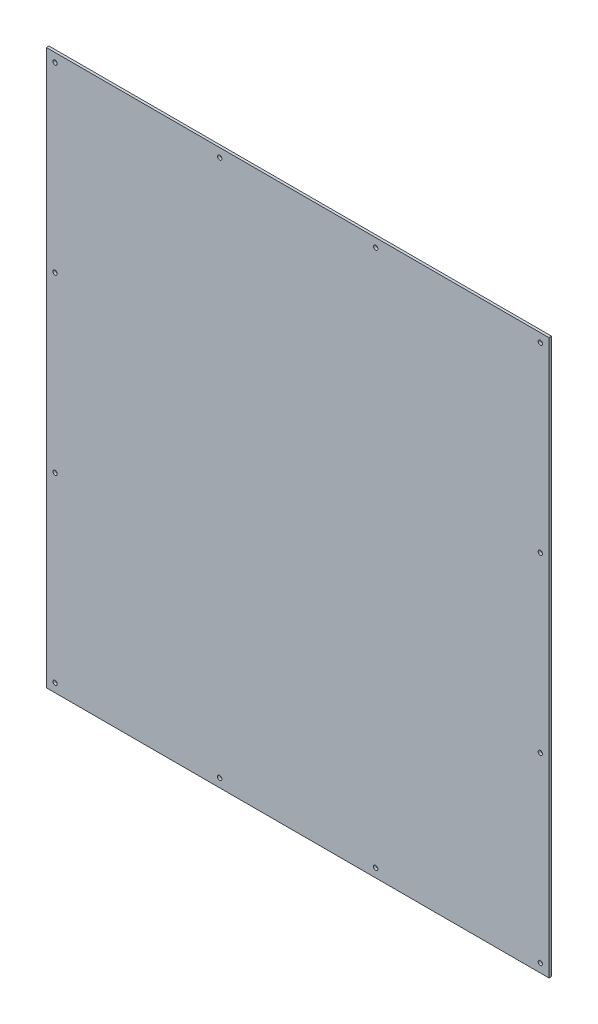
ISO-10303-21;
HEADER;
FILE_DESCRIPTION(('STEP AP214'),'2;1');
FILE_NAME('part.step','',(''),(''),'','','');
FILE_SCHEMA(('AUTOMOTIVE_DESIGN { 1 0 10303 214 1 1 1 1 }'));
ENDSEC;
DATA;
#1=APPLICATION_CONTEXT('core data for automotive mechanical design processes');
#2=APPLICATION_PROTOCOL_DEFINITION('international standard','automotive_design',2000,#1);
#3=PRODUCT_CONTEXT('',#1,'mechanical');
#4=PRODUCT('Part','Part','',(#3));
#5=PRODUCT_RELATED_PRODUCT_CATEGORY('part','',(#4));
#6=PRODUCT_DEFINITION_FORMATION('','',#4);
#7=PRODUCT_DEFINITION_CONTEXT('part definition',#1,'design');
#8=PRODUCT_DEFINITION('design','',#6,#7);
#9=PRODUCT_DEFINITION_SHAPE('','',#8);
#10=(LENGTH_UNIT() NAMED_UNIT(*) SI_UNIT(.MILLI.,.METRE.));
#11=(NAMED_UNIT(*) PLANE_ANGLE_UNIT() SI_UNIT($,.RADIAN.));
#12=(NAMED_UNIT(*) SI_UNIT($,.STERADIAN.) SOLID_ANGLE_UNIT());
#13=UNCERTAINTY_MEASURE_WITH_UNIT(LENGTH_MEASURE(1.E-05),#10,'distance_accuracy_value','');
#14=(GEOMETRIC_REPRESENTATION_CONTEXT(3) GLOBAL_UNCERTAINTY_ASSIGNED_CONTEXT((#13)) GLOBAL_UNIT_ASSIGNED_CONTEXT((#10,
#11,#12)) REPRESENTATION_CONTEXT('',''));
#15=CARTESIAN_POINT('',(0.,0.,0.));
#16=DIRECTION('',(0.,0.,1.));
#17=DIRECTION('',(1.,0.,0.));
#18=AXIS2_PLACEMENT_3D('',#15,#16,#17);
#19=CARTESIAN_POINT('',(-219.558359621451,289.085173501577,3.));
#20=DIRECTION('',(1.,0.,0.));
#21=DIRECTION('',(0.,1.,0.));
#22=AXIS2_PLACEMENT_3D('',#19,#20,#21);
#23=PLANE('',#22);
#24=DIRECTION('',(0.,-1.,0.));
#25=VECTOR('',#24,1.);
#26=CARTESIAN_POINT('',(-219.558359621451,289.085173501577,0.));
#27=LINE('',#26,#25);
#28=CARTESIAN_POINT('',(-219.558359621451,289.085173501577,0.));
#29=VERTEX_POINT('',#28);
#30=CARTESIAN_POINT('',(-219.558359621451,-350.914826498423,0.));
#31=VERTEX_POINT('',#30);
#32=EDGE_CURVE('E96',#29,#31,#27,.T.);
#33=ORIENTED_EDGE('',*,*,#32,.T.);
#34=DIRECTION('',(0.,0.,-1.));
#35=VECTOR('',#34,1.);
#36=CARTESIAN_POINT('',(-219.558359621451,-350.914826498423,3.));
#37=LINE('',#36,#35);
#38=CARTESIAN_POINT('',(-219.558359621451,-350.914826498423,3.));
#39=VERTEX_POINT('',#38);
#40=EDGE_CURVE('E11',#39,#31,#37,.T.);
#41=ORIENTED_EDGE('',*,*,#40,.F.);
#42=DIRECTION('',(0.,-1.,0.));
#43=VECTOR('',#42,1.);
#44=CARTESIAN_POINT('',(-219.558359621451,289.085173501577,3.));
#45=LINE('',#44,#43);
#46=CARTESIAN_POINT('',(-219.558359621451,289.085173501577,3.));
#47=VERTEX_POINT('',#46);
#48=EDGE_CURVE('E84',#47,#39,#45,.T.);
#49=ORIENTED_EDGE('',*,*,#48,.F.);
#50=DIRECTION('',(0.,0.,-1.));
#51=VECTOR('',#50,1.);
#52=CARTESIAN_POINT('',(-219.558359621451,289.085173501577,3.));
#53=LINE('',#52,#51);
#54=EDGE_CURVE('E92',#47,#29,#53,.T.);
#55=ORIENTED_EDGE('',*,*,#54,.T.);
#56=EDGE_LOOP('',(#33,#41,#49,#55));
#57=FACE_BOUND('',#56,.T.);
#58=ADVANCED_FACE('F33',(#57),#23,.F.);
#59=CARTESIAN_POINT('',(-219.558359621451,-350.914826498423,3.));
#60=DIRECTION('',(0.,1.,0.));
#61=DIRECTION('',(0.,0.,1.));
#62=AXIS2_PLACEMENT_3D('',#59,#60,#61);
#63=PLANE('',#62);
#64=DIRECTION('',(1.,0.,0.));
#65=VECTOR('',#64,1.);
#66=CARTESIAN_POINT('',(-219.558359621451,-350.914826498423,0.));
#67=LINE('',#66,#65);
#68=CARTESIAN_POINT('',(360.441640378549,-350.914826498423,0.));
#69=VERTEX_POINT('',#68);
#70=EDGE_CURVE('E88',#31,#69,#67,.T.);
#71=ORIENTED_EDGE('',*,*,#70,.T.);
#72=DIRECTION('',(0.,0.,-1.));
#73=VECTOR('',#72,1.);
#74=CARTESIAN_POINT('',(360.441640378549,-350.914826498423,3.));
#75=LINE('',#74,#73);
#76=CARTESIAN_POINT('',(360.441640378549,-350.914826498423,3.));
#77=VERTEX_POINT('',#76);
#78=EDGE_CURVE('E41',#77,#69,#75,.T.);
#79=ORIENTED_EDGE('',*,*,#78,.F.);
#80=DIRECTION('',(1.,0.,0.));
#81=VECTOR('',#80,1.);
#82=CARTESIAN_POINT('',(-219.558359621451,-350.914826498423,3.));
#83=LINE('',#82,#81);
#84=EDGE_CURVE('E79',#39,#77,#83,.T.);
#85=ORIENTED_EDGE('',*,*,#84,.F.);
#86=ORIENTED_EDGE('',*,*,#40,.T.);
#87=EDGE_LOOP('',(#71,#79,#85,#86));
#88=FACE_BOUND('',#87,.T.);
#89=ADVANCED_FACE('F87',(#88),#63,.F.);
#90=CARTESIAN_POINT('',(360.441640378549,289.085173501577,3.));
#91=DIRECTION('',(-1.,0.,0.));
#92=DIRECTION('',(0.,-1.,0.));
#93=AXIS2_PLACEMENT_3D('',#90,#91,#92);
#94=PLANE('',#93);
#95=DIRECTION('',(0.,1.,0.));
#96=VECTOR('',#95,1.);
#97=CARTESIAN_POINT('',(360.441640378549,289.085173501577,0.));
#98=LINE('',#97,#96);
#99=CARTESIAN_POINT('',(360.441640378549,289.085173501577,0.));
#100=VERTEX_POINT('',#99);
#101=EDGE_CURVE('E66',#69,#100,#98,.T.);
#102=ORIENTED_EDGE('',*,*,#101,.T.);
#103=DIRECTION('',(0.,0.,-1.));
#104=VECTOR('',#103,1.);
#105=CARTESIAN_POINT('',(360.441640378549,289.085173501577,3.));
#106=LINE('',#105,#104);
#107=CARTESIAN_POINT('',(360.441640378549,289.085173501577,3.));
#108=VERTEX_POINT('',#107);
#109=EDGE_CURVE('E89',#108,#100,#106,.T.);
#110=ORIENTED_EDGE('',*,*,#109,.F.);
#111=DIRECTION('',(0.,1.,0.));
#112=VECTOR('',#111,1.);
#113=CARTESIAN_POINT('',(360.441640378549,289.085173501577,3.));
#114=LINE('',#113,#112);
#115=EDGE_CURVE('E82',#77,#108,#114,.T.);
#116=ORIENTED_EDGE('',*,*,#115,.F.);
#117=ORIENTED_EDGE('',*,*,#78,.T.);
#118=EDGE_LOOP('',(#102,#110,#116,#117));
#119=FACE_BOUND('',#118,.T.);
#120=ADVANCED_FACE('F90',(#119),#94,.F.);
#121=CARTESIAN_POINT('',(-219.558359621451,289.085173501577,3.));
#122=DIRECTION('',(0.,-1.,0.));
#123=DIRECTION('',(0.,0.,-1.));
#124=AXIS2_PLACEMENT_3D('',#121,#122,#123);
#125=PLANE('',#124);
#126=DIRECTION('',(-1.,0.,0.));
#127=VECTOR('',#126,1.);
#128=CARTESIAN_POINT('',(-219.558359621451,289.085173501577,0.));
#129=LINE('',#128,#127);
#130=EDGE_CURVE('E72',#100,#29,#129,.T.);
#131=ORIENTED_EDGE('',*,*,#130,.T.);
#132=ORIENTED_EDGE('',*,*,#54,.F.);
#133=DIRECTION('',(-1.,0.,0.));
#134=VECTOR('',#133,1.);
#135=CARTESIAN_POINT('',(-219.558359621451,289.085173501577,3.));
#136=LINE('',#135,#134);
#137=EDGE_CURVE('E49',#108,#47,#136,.T.);
#138=ORIENTED_EDGE('',*,*,#137,.F.);
#139=ORIENTED_EDGE('',*,*,#109,.T.);
#140=EDGE_LOOP('',(#131,#132,#138,#139));
#141=FACE_BOUND('',#140,.T.);
#142=ADVANCED_FACE('F104',(#141),#125,.F.);
#143=CARTESIAN_POINT('',(0.,0.,3.));
#144=DIRECTION('',(0.,0.,1.));
#145=DIRECTION('',(1.,0.,0.));
#146=AXIS2_PLACEMENT_3D('',#143,#144,#145);
#147=PLANE('',#146);
#148=CARTESIAN_POINT('',(-19.558359621451,-340.914826498423,3.));
#149=DIRECTION('',(0.,0.,1.));
#150=DIRECTION('',(1.,0.,0.));
#151=AXIS2_PLACEMENT_3D('',#148,#149,#150);
#152=CIRCLE('',#151,2.5);
#153=CARTESIAN_POINT('',(-17.058359621451,-340.914826498423,3.));
#154=VERTEX_POINT('',#153);
#155=EDGE_CURVE('E140',#154,#154,#152,.T.);
#156=ORIENTED_EDGE('',*,*,#155,.F.);
#157=EDGE_LOOP('',(#156));
#158=FACE_BOUND('',#157,.T.);
#159=CARTESIAN_POINT('',(350.441640378549,-340.914826498423,3.));
#160=DIRECTION('',(0.,0.,1.));
#161=DIRECTION('',(1.,0.,0.));
#162=AXIS2_PLACEMENT_3D('',#159,#160,#161);
#163=CIRCLE('',#162,2.49999999999997);
#164=CARTESIAN_POINT('',(352.941640378549,-340.914826498423,3.));
#165=VERTEX_POINT('',#164);
#166=EDGE_CURVE('E147',#165,#165,#163,.T.);
#167=ORIENTED_EDGE('',*,*,#166,.F.);
#168=EDGE_LOOP('',(#167));
#169=FACE_BOUND('',#168,.T.);
#170=CARTESIAN_POINT('',(350.441640378549,-130.914826498423,3.));
#171=DIRECTION('',(0.,0.,1.));
#172=DIRECTION('',(1.,0.,0.));
#173=AXIS2_PLACEMENT_3D('',#170,#171,#172);
#174=CIRCLE('',#173,2.49999999999996);
#175=CARTESIAN_POINT('',(352.941640378549,-130.914826498423,3.));
#176=VERTEX_POINT('',#175);
#177=EDGE_CURVE('E153',#176,#176,#174,.T.);
#178=ORIENTED_EDGE('',*,*,#177,.F.);
#179=EDGE_LOOP('',(#178));
#180=FACE_BOUND('',#179,.T.);
#181=CARTESIAN_POINT('',(350.441640378549,69.0851735015771,3.));
#182=DIRECTION('',(0.,0.,1.));
#183=DIRECTION('',(1.,0.,0.));
#184=AXIS2_PLACEMENT_3D('',#181,#182,#183);
#185=CIRCLE('',#184,2.49999999999997);
#186=CARTESIAN_POINT('',(352.941640378549,69.0851735015771,3.));
#187=VERTEX_POINT('',#186);
#188=EDGE_CURVE('E159',#187,#187,#185,.T.);
#189=ORIENTED_EDGE('',*,*,#188,.F.);
#190=EDGE_LOOP('',(#189));
#191=FACE_BOUND('',#190,.T.);
#192=CARTESIAN_POINT('',(-209.558359621451,69.0851735015771,3.));
#193=DIRECTION('',(0.,0.,1.));
#194=DIRECTION('',(1.,0.,0.));
#195=AXIS2_PLACEMENT_3D('',#192,#193,#194);
#196=CIRCLE('',#195,2.5);
#197=CARTESIAN_POINT('',(-207.058359621451,69.0851735015771,3.));
#198=VERTEX_POINT('',#197);
#199=EDGE_CURVE('E123',#198,#198,#196,.T.);
#200=ORIENTED_EDGE('',*,*,#199,.F.);
#201=EDGE_LOOP('',(#200));
#202=FACE_BOUND('',#201,.T.);
#203=CARTESIAN_POINT('',(-209.558359621451,-340.914826498423,3.));
#204=DIRECTION('',(0.,0.,1.));
#205=DIRECTION('',(1.,0.,0.));
#206=AXIS2_PLACEMENT_3D('',#203,#204,#205);
#207=CIRCLE('',#206,2.5);
#208=CARTESIAN_POINT('',(-207.058359621451,-340.914826498423,3.));
#209=VERTEX_POINT('',#208);
#210=EDGE_CURVE('E116',#209,#209,#207,.T.);
#211=ORIENTED_EDGE('',*,*,#210,.F.);
#212=EDGE_LOOP('',(#211));
#213=FACE_BOUND('',#212,.T.);
#214=CARTESIAN_POINT('',(-209.558359621451,-130.914826498423,3.));
#215=DIRECTION('',(0.,0.,1.));
#216=DIRECTION('',(1.,0.,0.));
#217=AXIS2_PLACEMENT_3D('',#214,#215,#216);
#218=CIRCLE('',#217,2.5);
#219=CARTESIAN_POINT('',(-207.058359621451,-130.914826498423,3.));
#220=VERTEX_POINT('',#219);
#221=EDGE_CURVE('E135',#220,#220,#218,.T.);
#222=ORIENTED_EDGE('',*,*,#221,.F.);
#223=EDGE_LOOP('',(#222));
#224=FACE_BOUND('',#223,.T.);
#225=CARTESIAN_POINT('',(350.441640378549,279.085173501577,3.));
#226=DIRECTION('',(0.,0.,1.));
#227=DIRECTION('',(1.,0.,0.));
#228=AXIS2_PLACEMENT_3D('',#225,#226,#227);
#229=CIRCLE('',#228,2.49999999999997);
#230=CARTESIAN_POINT('',(352.941640378549,279.085173501577,3.));
#231=VERTEX_POINT('',#230);
#232=EDGE_CURVE('E128',#231,#231,#229,.T.);
#233=ORIENTED_EDGE('',*,*,#232,.F.);
#234=EDGE_LOOP('',(#233));
#235=FACE_BOUND('',#234,.T.);
#236=CARTESIAN_POINT('',(160.441640378549,279.085173501577,3.));
#237=DIRECTION('',(0.,0.,1.));
#238=DIRECTION('',(1.,0.,0.));
#239=AXIS2_PLACEMENT_3D('',#236,#237,#238);
#240=CIRCLE('',#239,2.5);
#241=CARTESIAN_POINT('',(162.941640378549,279.085173501577,3.));
#242=VERTEX_POINT('',#241);
#243=EDGE_CURVE('E176',#242,#242,#240,.T.);
#244=ORIENTED_EDGE('',*,*,#243,.F.);
#245=EDGE_LOOP('',(#244));
#246=FACE_BOUND('',#245,.T.);
#247=CARTESIAN_POINT('',(-19.558359621451,279.085173501577,3.));
#248=DIRECTION('',(0.,0.,1.));
#249=DIRECTION('',(1.,0.,0.));
#250=AXIS2_PLACEMENT_3D('',#247,#248,#249);
#251=CIRCLE('',#250,2.5);
#252=CARTESIAN_POINT('',(-17.058359621451,279.085173501577,3.));
#253=VERTEX_POINT('',#252);
#254=EDGE_CURVE('E164',#253,#253,#251,.T.);
#255=ORIENTED_EDGE('',*,*,#254,.F.);
#256=EDGE_LOOP('',(#255));
#257=FACE_BOUND('',#256,.T.);
#258=CARTESIAN_POINT('',(160.441640378549,-340.914826498423,3.));
#259=DIRECTION('',(0.,0.,1.));
#260=DIRECTION('',(1.,0.,0.));
#261=AXIS2_PLACEMENT_3D('',#258,#259,#260);
#262=CIRCLE('',#261,2.5);
#263=CARTESIAN_POINT('',(162.941640378549,-340.914826498423,3.));
#264=VERTEX_POINT('',#263);
#265=EDGE_CURVE('E171',#264,#264,#262,.T.);
#266=ORIENTED_EDGE('',*,*,#265,.F.);
#267=EDGE_LOOP('',(#266));
#268=FACE_BOUND('',#267,.T.);
#269=CARTESIAN_POINT('',(-209.558359621451,279.085173501577,3.));
#270=DIRECTION('',(0.,0.,1.));
#271=DIRECTION('',(1.,0.,0.));
#272=AXIS2_PLACEMENT_3D('',#269,#270,#271);
#273=CIRCLE('',#272,2.5);
#274=CARTESIAN_POINT('',(-207.058359621451,279.085173501577,3.));
#275=VERTEX_POINT('',#274);
#276=EDGE_CURVE('E110',#275,#275,#273,.T.);
#277=ORIENTED_EDGE('',*,*,#276,.F.);
#278=EDGE_LOOP('',(#277));
#279=FACE_BOUND('',#278,.T.);
#280=ORIENTED_EDGE('',*,*,#48,.T.);
#281=ORIENTED_EDGE('',*,*,#84,.T.);
#282=ORIENTED_EDGE('',*,*,#115,.T.);
#283=ORIENTED_EDGE('',*,*,#137,.T.);
#284=EDGE_LOOP('',(#280,#281,#282,#283));
#285=FACE_BOUND('',#284,.T.);
#286=ADVANCED_FACE('F80',(#158,#169,#180,#191,#202,#213,#224,#235,#246,#257,#268,#279,#285),
#147,.T.);
#287=CARTESIAN_POINT('',(0.,0.,0.));
#288=DIRECTION('',(0.,0.,1.));
#289=DIRECTION('',(1.,0.,0.));
#290=AXIS2_PLACEMENT_3D('',#287,#288,#289);
#291=PLANE('',#290);
#292=CARTESIAN_POINT('',(-19.558359621451,-340.914826498423,0.));
#293=DIRECTION('',(0.,0.,1.));
#294=DIRECTION('',(1.,0.,0.));
#295=AXIS2_PLACEMENT_3D('',#292,#293,#294);
#296=CIRCLE('',#295,2.5);
#297=CARTESIAN_POINT('',(-17.058359621451,-340.914826498423,0.));
#298=VERTEX_POINT('',#297);
#299=EDGE_CURVE('E143',#298,#298,#296,.T.);
#300=ORIENTED_EDGE('',*,*,#299,.T.);
#301=EDGE_LOOP('',(#300));
#302=FACE_BOUND('',#301,.T.);
#303=CARTESIAN_POINT('',(350.441640378549,-340.914826498423,0.));
#304=DIRECTION('',(0.,0.,1.));
#305=DIRECTION('',(1.,0.,0.));
#306=AXIS2_PLACEMENT_3D('',#303,#304,#305);
#307=CIRCLE('',#306,2.49999999999997);
#308=CARTESIAN_POINT('',(352.941640378549,-340.914826498423,0.));
#309=VERTEX_POINT('',#308);
#310=EDGE_CURVE('E150',#309,#309,#307,.T.);
#311=ORIENTED_EDGE('',*,*,#310,.T.);
#312=EDGE_LOOP('',(#311));
#313=FACE_BOUND('',#312,.T.);
#314=CARTESIAN_POINT('',(350.441640378549,-130.914826498423,0.));
#315=DIRECTION('',(0.,0.,1.));
#316=DIRECTION('',(1.,0.,0.));
#317=AXIS2_PLACEMENT_3D('',#314,#315,#316);
#318=CIRCLE('',#317,2.49999999999996);
#319=CARTESIAN_POINT('',(352.941640378549,-130.914826498423,0.));
#320=VERTEX_POINT('',#319);
#321=EDGE_CURVE('E156',#320,#320,#318,.T.);
#322=ORIENTED_EDGE('',*,*,#321,.T.);
#323=EDGE_LOOP('',(#322));
#324=FACE_BOUND('',#323,.T.);
#325=CARTESIAN_POINT('',(350.441640378549,69.0851735015771,0.));
#326=DIRECTION('',(0.,0.,1.));
#327=DIRECTION('',(1.,0.,0.));
#328=AXIS2_PLACEMENT_3D('',#325,#326,#327);
#329=CIRCLE('',#328,2.49999999999997);
#330=CARTESIAN_POINT('',(352.941640378549,69.0851735015771,0.));
#331=VERTEX_POINT('',#330);
#332=EDGE_CURVE('E132',#331,#331,#329,.T.);
#333=ORIENTED_EDGE('',*,*,#332,.T.);
#334=EDGE_LOOP('',(#333));
#335=FACE_BOUND('',#334,.T.);
#336=CARTESIAN_POINT('',(-209.558359621451,69.0851735015771,0.));
#337=DIRECTION('',(0.,0.,1.));
#338=DIRECTION('',(1.,0.,0.));
#339=AXIS2_PLACEMENT_3D('',#336,#337,#338);
#340=CIRCLE('',#339,2.5);
#341=CARTESIAN_POINT('',(-207.058359621451,69.0851735015771,0.));
#342=VERTEX_POINT('',#341);
#343=EDGE_CURVE('E113',#342,#342,#340,.T.);
#344=ORIENTED_EDGE('',*,*,#343,.T.);
#345=EDGE_LOOP('',(#344));
#346=FACE_BOUND('',#345,.T.);
#347=CARTESIAN_POINT('',(-209.558359621451,-340.914826498423,0.));
#348=DIRECTION('',(0.,0.,1.));
#349=DIRECTION('',(1.,0.,0.));
#350=AXIS2_PLACEMENT_3D('',#347,#348,#349);
#351=CIRCLE('',#350,2.5);
#352=CARTESIAN_POINT('',(-207.058359621451,-340.914826498423,0.));
#353=VERTEX_POINT('',#352);
#354=EDGE_CURVE('E119',#353,#353,#351,.T.);
#355=ORIENTED_EDGE('',*,*,#354,.T.);
#356=EDGE_LOOP('',(#355));
#357=FACE_BOUND('',#356,.T.);
#358=CARTESIAN_POINT('',(-209.558359621451,-130.914826498423,0.));
#359=DIRECTION('',(0.,0.,1.));
#360=DIRECTION('',(1.,0.,0.));
#361=AXIS2_PLACEMENT_3D('',#358,#359,#360);
#362=CIRCLE('',#361,2.5);
#363=CARTESIAN_POINT('',(-207.058359621451,-130.914826498423,0.));
#364=VERTEX_POINT('',#363);
#365=EDGE_CURVE('E120',#364,#364,#362,.T.);
#366=ORIENTED_EDGE('',*,*,#365,.T.);
#367=EDGE_LOOP('',(#366));
#368=FACE_BOUND('',#367,.T.);
#369=CARTESIAN_POINT('',(350.441640378549,279.085173501577,0.));
#370=DIRECTION('',(0.,0.,1.));
#371=DIRECTION('',(1.,0.,0.));
#372=AXIS2_PLACEMENT_3D('',#369,#370,#371);
#373=CIRCLE('',#372,2.49999999999997);
#374=CARTESIAN_POINT('',(352.941640378549,279.085173501577,0.));
#375=VERTEX_POINT('',#374);
#376=EDGE_CURVE('E131',#375,#375,#373,.T.);
#377=ORIENTED_EDGE('',*,*,#376,.T.);
#378=EDGE_LOOP('',(#377));
#379=FACE_BOUND('',#378,.T.);
#380=CARTESIAN_POINT('',(160.441640378549,279.085173501577,0.));
#381=DIRECTION('',(0.,0.,1.));
#382=DIRECTION('',(1.,0.,0.));
#383=AXIS2_PLACEMENT_3D('',#380,#381,#382);
#384=CIRCLE('',#383,2.5);
#385=CARTESIAN_POINT('',(162.941640378549,279.085173501577,0.));
#386=VERTEX_POINT('',#385);
#387=EDGE_CURVE('E168',#386,#386,#384,.T.);
#388=ORIENTED_EDGE('',*,*,#387,.T.);
#389=EDGE_LOOP('',(#388));
#390=FACE_BOUND('',#389,.T.);
#391=CARTESIAN_POINT('',(-19.558359621451,279.085173501577,0.));
#392=DIRECTION('',(0.,0.,1.));
#393=DIRECTION('',(1.,0.,0.));
#394=AXIS2_PLACEMENT_3D('',#391,#392,#393);
#395=CIRCLE('',#394,2.5);
#396=CARTESIAN_POINT('',(-17.058359621451,279.085173501577,0.));
#397=VERTEX_POINT('',#396);
#398=EDGE_CURVE('E167',#397,#397,#395,.T.);
#399=ORIENTED_EDGE('',*,*,#398,.T.);
#400=EDGE_LOOP('',(#399));
#401=FACE_BOUND('',#400,.T.);
#402=CARTESIAN_POINT('',(160.441640378549,-340.914826498423,0.));
#403=DIRECTION('',(0.,0.,1.));
#404=DIRECTION('',(1.,0.,0.));
#405=AXIS2_PLACEMENT_3D('',#402,#403,#404);
#406=CIRCLE('',#405,2.5);
#407=CARTESIAN_POINT('',(162.941640378549,-340.914826498423,0.));
#408=VERTEX_POINT('',#407);
#409=EDGE_CURVE('E144',#408,#408,#406,.T.);
#410=ORIENTED_EDGE('',*,*,#409,.T.);
#411=EDGE_LOOP('',(#410));
#412=FACE_BOUND('',#411,.T.);
#413=CARTESIAN_POINT('',(-209.558359621451,279.085173501577,0.));
#414=DIRECTION('',(0.,0.,1.));
#415=DIRECTION('',(1.,0.,0.));
#416=AXIS2_PLACEMENT_3D('',#413,#414,#415);
#417=CIRCLE('',#416,2.5);
#418=CARTESIAN_POINT('',(-207.058359621451,279.085173501577,0.));
#419=VERTEX_POINT('',#418);
#420=EDGE_CURVE('E99',#419,#419,#417,.T.);
#421=ORIENTED_EDGE('',*,*,#420,.T.);
#422=EDGE_LOOP('',(#421));
#423=FACE_BOUND('',#422,.T.);
#424=ORIENTED_EDGE('',*,*,#32,.F.);
#425=ORIENTED_EDGE('',*,*,#130,.F.);
#426=ORIENTED_EDGE('',*,*,#101,.F.);
#427=ORIENTED_EDGE('',*,*,#70,.F.);
#428=EDGE_LOOP('',(#424,#425,#426,#427));
#429=FACE_BOUND('',#428,.T.);
#430=ADVANCED_FACE('F107',(#302,#313,#324,#335,#346,#357,#368,#379,#390,#401,#412,#423,#429),
#291,.F.);
#431=CARTESIAN_POINT('',(-209.558359621451,279.085173501577,0.));
#432=DIRECTION('',(0.,0.,1.));
#433=DIRECTION('',(1.,0.,0.));
#434=AXIS2_PLACEMENT_3D('',#431,#432,#433);
#435=CYLINDRICAL_SURFACE('',#434,2.5);
#436=ORIENTED_EDGE('',*,*,#420,.F.);
#437=EDGE_LOOP('',(#436));
#438=FACE_BOUND('',#437,.T.);
#439=ORIENTED_EDGE('',*,*,#276,.T.);
#440=EDGE_LOOP('',(#439));
#441=FACE_BOUND('',#440,.T.);
#442=ADVANCED_FACE('F202',(#438,#441),#435,.F.);
#443=CARTESIAN_POINT('',(160.441640378549,-340.914826498423,0.));
#444=DIRECTION('',(0.,0.,1.));
#445=DIRECTION('',(1.,0.,0.));
#446=AXIS2_PLACEMENT_3D('',#443,#444,#445);
#447=CYLINDRICAL_SURFACE('',#446,2.5);
#448=ORIENTED_EDGE('',*,*,#409,.F.);
#449=EDGE_LOOP('',(#448));
#450=FACE_BOUND('',#449,.T.);
#451=ORIENTED_EDGE('',*,*,#265,.T.);
#452=EDGE_LOOP('',(#451));
#453=FACE_BOUND('',#452,.T.);
#454=ADVANCED_FACE('F204',(#450,#453),#447,.F.);
#455=CARTESIAN_POINT('',(-19.558359621451,279.085173501577,0.));
#456=DIRECTION('',(0.,0.,1.));
#457=DIRECTION('',(1.,0.,0.));
#458=AXIS2_PLACEMENT_3D('',#455,#456,#457);
#459=CYLINDRICAL_SURFACE('',#458,2.5);
#460=ORIENTED_EDGE('',*,*,#398,.F.);
#461=EDGE_LOOP('',(#460));
#462=FACE_BOUND('',#461,.T.);
#463=ORIENTED_EDGE('',*,*,#254,.T.);
#464=EDGE_LOOP('',(#463));
#465=FACE_BOUND('',#464,.T.);
#466=ADVANCED_FACE('F188',(#462,#465),#459,.F.);
#467=CARTESIAN_POINT('',(160.441640378549,279.085173501577,0.));
#468=DIRECTION('',(0.,0.,1.));
#469=DIRECTION('',(1.,0.,0.));
#470=AXIS2_PLACEMENT_3D('',#467,#468,#469);
#471=CYLINDRICAL_SURFACE('',#470,2.5);
#472=ORIENTED_EDGE('',*,*,#387,.F.);
#473=EDGE_LOOP('',(#472));
#474=FACE_BOUND('',#473,.T.);
#475=ORIENTED_EDGE('',*,*,#243,.T.);
#476=EDGE_LOOP('',(#475));
#477=FACE_BOUND('',#476,.T.);
#478=ADVANCED_FACE('F184',(#474,#477),#471,.F.);
#479=CARTESIAN_POINT('',(350.441640378549,279.085173501577,0.));
#480=DIRECTION('',(0.,0.,1.));
#481=DIRECTION('',(1.,0.,0.));
#482=AXIS2_PLACEMENT_3D('',#479,#480,#481);
#483=CYLINDRICAL_SURFACE('',#482,2.49999999999997);
#484=ORIENTED_EDGE('',*,*,#376,.F.);
#485=EDGE_LOOP('',(#484));
#486=FACE_BOUND('',#485,.T.);
#487=ORIENTED_EDGE('',*,*,#232,.T.);
#488=EDGE_LOOP('',(#487));
#489=FACE_BOUND('',#488,.T.);
#490=ADVANCED_FACE('F187',(#486,#489),#483,.F.);
#491=CARTESIAN_POINT('',(-209.558359621451,-130.914826498423,0.));
#492=DIRECTION('',(0.,0.,1.));
#493=DIRECTION('',(1.,0.,0.));
#494=AXIS2_PLACEMENT_3D('',#491,#492,#493);
#495=CYLINDRICAL_SURFACE('',#494,2.5);
#496=ORIENTED_EDGE('',*,*,#365,.F.);
#497=EDGE_LOOP('',(#496));
#498=FACE_BOUND('',#497,.T.);
#499=ORIENTED_EDGE('',*,*,#221,.T.);
#500=EDGE_LOOP('',(#499));
#501=FACE_BOUND('',#500,.T.);
#502=ADVANCED_FACE('F273',(#498,#501),#495,.F.);
#503=CARTESIAN_POINT('',(-209.558359621451,-340.914826498423,0.));
#504=DIRECTION('',(0.,0.,1.));
#505=DIRECTION('',(1.,0.,0.));
#506=AXIS2_PLACEMENT_3D('',#503,#504,#505);
#507=CYLINDRICAL_SURFACE('',#506,2.5);
#508=ORIENTED_EDGE('',*,*,#354,.F.);
#509=EDGE_LOOP('',(#508));
#510=FACE_BOUND('',#509,.T.);
#511=ORIENTED_EDGE('',*,*,#210,.T.);
#512=EDGE_LOOP('',(#511));
#513=FACE_BOUND('',#512,.T.);
#514=ADVANCED_FACE('F283',(#510,#513),#507,.F.);
#515=CARTESIAN_POINT('',(-209.558359621451,69.0851735015771,0.));
#516=DIRECTION('',(0.,0.,1.));
#517=DIRECTION('',(1.,0.,0.));
#518=AXIS2_PLACEMENT_3D('',#515,#516,#517);
#519=CYLINDRICAL_SURFACE('',#518,2.5);
#520=ORIENTED_EDGE('',*,*,#343,.F.);
#521=EDGE_LOOP('',(#520));
#522=FACE_BOUND('',#521,.T.);
#523=ORIENTED_EDGE('',*,*,#199,.T.);
#524=EDGE_LOOP('',(#523));
#525=FACE_BOUND('',#524,.T.);
#526=ADVANCED_FACE('F293',(#522,#525),#519,.F.);
#527=CARTESIAN_POINT('',(350.441640378549,69.0851735015771,0.));
#528=DIRECTION('',(0.,0.,1.));
#529=DIRECTION('',(1.,0.,0.));
#530=AXIS2_PLACEMENT_3D('',#527,#528,#529);
#531=CYLINDRICAL_SURFACE('',#530,2.49999999999997);
#532=ORIENTED_EDGE('',*,*,#332,.F.);
#533=EDGE_LOOP('',(#532));
#534=FACE_BOUND('',#533,.T.);
#535=ORIENTED_EDGE('',*,*,#188,.T.);
#536=EDGE_LOOP('',(#535));
#537=FACE_BOUND('',#536,.T.);
#538=ADVANCED_FACE('F302',(#534,#537),#531,.F.);
#539=CARTESIAN_POINT('',(350.441640378549,-130.914826498423,0.));
#540=DIRECTION('',(0.,0.,1.));
#541=DIRECTION('',(1.,0.,0.));
#542=AXIS2_PLACEMENT_3D('',#539,#540,#541);
#543=CYLINDRICAL_SURFACE('',#542,2.49999999999996);
#544=ORIENTED_EDGE('',*,*,#321,.F.);
#545=EDGE_LOOP('',(#544));
#546=FACE_BOUND('',#545,.T.);
#547=ORIENTED_EDGE('',*,*,#177,.T.);
#548=EDGE_LOOP('',(#547));
#549=FACE_BOUND('',#548,.T.);
#550=ADVANCED_FACE('F312',(#546,#549),#543,.F.);
#551=CARTESIAN_POINT('',(350.441640378549,-340.914826498423,0.));
#552=DIRECTION('',(0.,0.,1.));
#553=DIRECTION('',(1.,0.,0.));
#554=AXIS2_PLACEMENT_3D('',#551,#552,#553);
#555=CYLINDRICAL_SURFACE('',#554,2.49999999999997);
#556=ORIENTED_EDGE('',*,*,#310,.F.);
#557=EDGE_LOOP('',(#556));
#558=FACE_BOUND('',#557,.T.);
#559=ORIENTED_EDGE('',*,*,#166,.T.);
#560=EDGE_LOOP('',(#559));
#561=FACE_BOUND('',#560,.T.);
#562=ADVANCED_FACE('F322',(#558,#561),#555,.F.);
#563=CARTESIAN_POINT('',(-19.558359621451,-340.914826498423,0.));
#564=DIRECTION('',(0.,0.,1.));
#565=DIRECTION('',(1.,0.,0.));
#566=AXIS2_PLACEMENT_3D('',#563,#564,#565);
#567=CYLINDRICAL_SURFACE('',#566,2.5);
#568=ORIENTED_EDGE('',*,*,#299,.F.);
#569=EDGE_LOOP('',(#568));
#570=FACE_BOUND('',#569,.T.);
#571=ORIENTED_EDGE('',*,*,#155,.T.);
#572=EDGE_LOOP('',(#571));
#573=FACE_BOUND('',#572,.T.);
#574=ADVANCED_FACE('F332',(#570,#573),#567,.F.);
#575=CLOSED_SHELL('',(#58,#89,#120,#142,#286,#430,#442,#454,#466,#478,#490,#502,#514,#526,#538,
#550,#562,#574));
#576=MANIFOLD_SOLID_BREP('B2',#575);
#577=ADVANCED_BREP_SHAPE_REPRESENTATION('',(#18,#576),#14);
#578=SHAPE_DEFINITION_REPRESENTATION(#9,#577);
ENDSEC;
END-ISO-10303-21;
